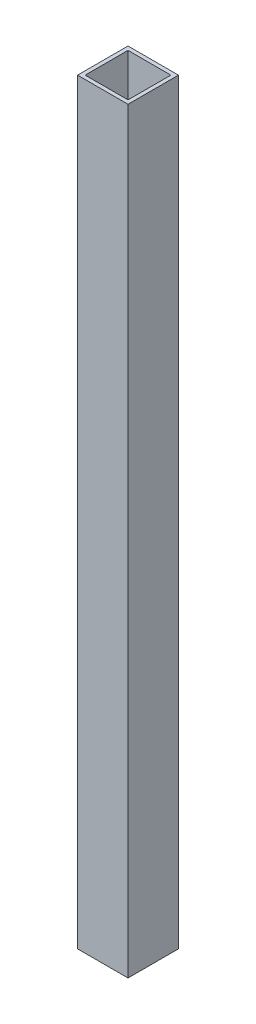
ISO-10303-21;
HEADER;
FILE_DESCRIPTION(('STEP AP214'),'2;1');
FILE_NAME('part.step','',(''),(''),'','','');
FILE_SCHEMA(('AUTOMOTIVE_DESIGN { 1 0 10303 214 1 1 1 1 }'));
ENDSEC;
DATA;
#1=APPLICATION_CONTEXT('core data for automotive mechanical design processes');
#2=APPLICATION_PROTOCOL_DEFINITION('international standard','automotive_design',2000,#1);
#3=PRODUCT_CONTEXT('',#1,'mechanical');
#4=PRODUCT('Part','Part','',(#3));
#5=PRODUCT_RELATED_PRODUCT_CATEGORY('part','',(#4));
#6=PRODUCT_DEFINITION_FORMATION('','',#4);
#7=PRODUCT_DEFINITION_CONTEXT('part definition',#1,'design');
#8=PRODUCT_DEFINITION('design','',#6,#7);
#9=PRODUCT_DEFINITION_SHAPE('','',#8);
#10=(LENGTH_UNIT() NAMED_UNIT(*) SI_UNIT(.MILLI.,.METRE.));
#11=(NAMED_UNIT(*) PLANE_ANGLE_UNIT() SI_UNIT($,.RADIAN.));
#12=(NAMED_UNIT(*) SI_UNIT($,.STERADIAN.) SOLID_ANGLE_UNIT());
#13=UNCERTAINTY_MEASURE_WITH_UNIT(LENGTH_MEASURE(1.E-05),#10,'distance_accuracy_value','');
#14=(GEOMETRIC_REPRESENTATION_CONTEXT(3) GLOBAL_UNCERTAINTY_ASSIGNED_CONTEXT((#13)) GLOBAL_UNIT_ASSIGNED_CONTEXT((#10,
#11,#12)) REPRESENTATION_CONTEXT('',''));
#15=CARTESIAN_POINT('',(0.,0.,0.));
#16=DIRECTION('',(0.,0.,1.));
#17=DIRECTION('',(1.,0.,0.));
#18=AXIS2_PLACEMENT_3D('',#15,#16,#17);
#19=CARTESIAN_POINT('',(0.,300.,0.));
#20=DIRECTION('',(0.,-1.,0.));
#21=DIRECTION('',(0.,0.,-1.));
#22=AXIS2_PLACEMENT_3D('',#19,#20,#21);
#23=PLANE('',#22);
#24=DIRECTION('',(0.,0.,-1.));
#25=VECTOR('',#24,1.);
#26=CARTESIAN_POINT('',(10.,300.,10.));
#27=LINE('',#26,#25);
#28=CARTESIAN_POINT('',(10.,300.,10.));
#29=VERTEX_POINT('',#28);
#30=CARTESIAN_POINT('',(10.,300.,-9.99999999999999));
#31=VERTEX_POINT('',#30);
#32=EDGE_CURVE('E155',#29,#31,#27,.T.);
#33=ORIENTED_EDGE('',*,*,#32,.T.);
#34=DIRECTION('',(-1.,0.,0.));
#35=VECTOR('',#34,1.);
#36=CARTESIAN_POINT('',(-9.99999999999996,300.,-9.99999999999999));
#37=LINE('',#36,#35);
#38=CARTESIAN_POINT('',(-9.99999999999996,300.,-9.99999999999999));
#39=VERTEX_POINT('',#38);
#40=EDGE_CURVE('E159',#31,#39,#37,.T.);
#41=ORIENTED_EDGE('',*,*,#40,.T.);
#42=DIRECTION('',(0.,0.,1.));
#43=VECTOR('',#42,1.);
#44=CARTESIAN_POINT('',(-9.99999999999996,300.,10.));
#45=LINE('',#44,#43);
#46=CARTESIAN_POINT('',(-9.99999999999996,300.,10.));
#47=VERTEX_POINT('',#46);
#48=EDGE_CURVE('E163',#39,#47,#45,.T.);
#49=ORIENTED_EDGE('',*,*,#48,.T.);
#50=DIRECTION('',(1.,0.,0.));
#51=VECTOR('',#50,1.);
#52=CARTESIAN_POINT('',(-9.99999999999996,300.,10.));
#53=LINE('',#52,#51);
#54=EDGE_CURVE('E166',#47,#29,#53,.T.);
#55=ORIENTED_EDGE('',*,*,#54,.T.);
#56=EDGE_LOOP('',(#33,#41,#49,#55));
#57=FACE_BOUND('',#56,.T.);
#58=DIRECTION('',(0.,0.,-1.));
#59=VECTOR('',#58,1.);
#60=CARTESIAN_POINT('',(8.5,300.,8.50000000000001));
#61=LINE('',#60,#59);
#62=CARTESIAN_POINT('',(8.5,300.,8.50000000000001));
#63=VERTEX_POINT('',#62);
#64=CARTESIAN_POINT('',(8.50000000000001,300.,-8.5));
#65=VERTEX_POINT('',#64);
#66=EDGE_CURVE('E107',#63,#65,#61,.T.);
#67=ORIENTED_EDGE('',*,*,#66,.F.);
#68=DIRECTION('',(1.,0.,0.));
#69=VECTOR('',#68,1.);
#70=CARTESIAN_POINT('',(-8.5,300.,8.50000000000001));
#71=LINE('',#70,#69);
#72=CARTESIAN_POINT('',(-8.5,300.,8.50000000000001));
#73=VERTEX_POINT('',#72);
#74=EDGE_CURVE('E133',#73,#63,#71,.T.);
#75=ORIENTED_EDGE('',*,*,#74,.F.);
#76=DIRECTION('',(0.,0.,1.));
#77=VECTOR('',#76,1.);
#78=CARTESIAN_POINT('',(-8.5,300.,8.50000000000001));
#79=LINE('',#78,#77);
#80=CARTESIAN_POINT('',(-8.49999999999999,300.,-8.5));
#81=VERTEX_POINT('',#80);
#82=EDGE_CURVE('E129',#81,#73,#79,.T.);
#83=ORIENTED_EDGE('',*,*,#82,.F.);
#84=DIRECTION('',(-1.,0.,0.));
#85=VECTOR('',#84,1.);
#86=CARTESIAN_POINT('',(-8.49999999999999,300.,-8.5));
#87=LINE('',#86,#85);
#88=EDGE_CURVE('E116',#65,#81,#87,.T.);
#89=ORIENTED_EDGE('',*,*,#88,.F.);
#90=EDGE_LOOP('',(#67,#75,#83,#89));
#91=FACE_BOUND('',#90,.T.);
#92=ADVANCED_FACE('F41',(#57,#91),#23,.F.);
#93=CARTESIAN_POINT('',(0.,0.,0.));
#94=DIRECTION('',(0.,-1.,0.));
#95=DIRECTION('',(0.,0.,-1.));
#96=AXIS2_PLACEMENT_3D('',#93,#94,#95);
#97=PLANE('',#96);
#98=DIRECTION('',(0.,0.,-1.));
#99=VECTOR('',#98,1.);
#100=CARTESIAN_POINT('',(10.,0.,10.));
#101=LINE('',#100,#99);
#102=CARTESIAN_POINT('',(10.,0.,10.));
#103=VERTEX_POINT('',#102);
#104=CARTESIAN_POINT('',(10.,0.,-9.99999999999999));
#105=VERTEX_POINT('',#104);
#106=EDGE_CURVE('E125',#103,#105,#101,.T.);
#107=ORIENTED_EDGE('',*,*,#106,.F.);
#108=DIRECTION('',(1.,0.,0.));
#109=VECTOR('',#108,1.);
#110=CARTESIAN_POINT('',(-9.99999999999996,0.,10.));
#111=LINE('',#110,#109);
#112=CARTESIAN_POINT('',(-9.99999999999996,0.,10.));
#113=VERTEX_POINT('',#112);
#114=EDGE_CURVE('E160',#113,#103,#111,.T.);
#115=ORIENTED_EDGE('',*,*,#114,.F.);
#116=DIRECTION('',(0.,0.,1.));
#117=VECTOR('',#116,1.);
#118=CARTESIAN_POINT('',(-9.99999999999996,0.,10.));
#119=LINE('',#118,#117);
#120=CARTESIAN_POINT('',(-9.99999999999996,0.,-9.99999999999999));
#121=VERTEX_POINT('',#120);
#122=EDGE_CURVE('E176',#121,#113,#119,.T.);
#123=ORIENTED_EDGE('',*,*,#122,.F.);
#124=DIRECTION('',(-1.,0.,0.));
#125=VECTOR('',#124,1.);
#126=CARTESIAN_POINT('',(-9.99999999999996,0.,-9.99999999999999));
#127=LINE('',#126,#125);
#128=EDGE_CURVE('E173',#105,#121,#127,.T.);
#129=ORIENTED_EDGE('',*,*,#128,.F.);
#130=EDGE_LOOP('',(#107,#115,#123,#129));
#131=FACE_BOUND('',#130,.T.);
#132=DIRECTION('',(1.,0.,0.));
#133=VECTOR('',#132,1.);
#134=CARTESIAN_POINT('',(-8.5,0.,8.50000000000001));
#135=LINE('',#134,#133);
#136=CARTESIAN_POINT('',(-8.5,0.,8.50000000000001));
#137=VERTEX_POINT('',#136);
#138=CARTESIAN_POINT('',(8.5,0.,8.50000000000001));
#139=VERTEX_POINT('',#138);
#140=EDGE_CURVE('E117',#137,#139,#135,.T.);
#141=ORIENTED_EDGE('',*,*,#140,.T.);
#142=DIRECTION('',(0.,0.,-1.));
#143=VECTOR('',#142,1.);
#144=CARTESIAN_POINT('',(8.5,0.,8.50000000000001));
#145=LINE('',#144,#143);
#146=CARTESIAN_POINT('',(8.50000000000001,0.,-8.5));
#147=VERTEX_POINT('',#146);
#148=EDGE_CURVE('E65',#139,#147,#145,.T.);
#149=ORIENTED_EDGE('',*,*,#148,.T.);
#150=DIRECTION('',(-1.,0.,0.));
#151=VECTOR('',#150,1.);
#152=CARTESIAN_POINT('',(-8.49999999999999,0.,-8.5));
#153=LINE('',#152,#151);
#154=CARTESIAN_POINT('',(-8.49999999999999,0.,-8.5));
#155=VERTEX_POINT('',#154);
#156=EDGE_CURVE('E123',#147,#155,#153,.T.);
#157=ORIENTED_EDGE('',*,*,#156,.T.);
#158=DIRECTION('',(0.,0.,1.));
#159=VECTOR('',#158,1.);
#160=CARTESIAN_POINT('',(-8.5,0.,8.50000000000001));
#161=LINE('',#160,#159);
#162=EDGE_CURVE('E142',#155,#137,#161,.T.);
#163=ORIENTED_EDGE('',*,*,#162,.T.);
#164=EDGE_LOOP('',(#141,#149,#157,#163));
#165=FACE_BOUND('',#164,.T.);
#166=ADVANCED_FACE('F199',(#131,#165),#97,.T.);
#167=CARTESIAN_POINT('',(10.,300.,10.));
#168=DIRECTION('',(-1.,0.,0.));
#169=DIRECTION('',(0.,0.,1.));
#170=AXIS2_PLACEMENT_3D('',#167,#168,#169);
#171=PLANE('',#170);
#172=ORIENTED_EDGE('',*,*,#106,.T.);
#173=DIRECTION('',(0.,-1.,0.));
#174=VECTOR('',#173,1.);
#175=CARTESIAN_POINT('',(10.,300.,-9.99999999999999));
#176=LINE('',#175,#174);
#177=EDGE_CURVE('E11',#31,#105,#176,.T.);
#178=ORIENTED_EDGE('',*,*,#177,.F.);
#179=ORIENTED_EDGE('',*,*,#32,.F.);
#180=DIRECTION('',(0.,-1.,0.));
#181=VECTOR('',#180,1.);
#182=CARTESIAN_POINT('',(10.,300.,10.));
#183=LINE('',#182,#181);
#184=EDGE_CURVE('E169',#29,#103,#183,.T.);
#185=ORIENTED_EDGE('',*,*,#184,.T.);
#186=EDGE_LOOP('',(#172,#178,#179,#185));
#187=FACE_BOUND('',#186,.T.);
#188=ADVANCED_FACE('F43',(#187),#171,.F.);
#189=CARTESIAN_POINT('',(-9.99999999999996,300.,-9.99999999999999));
#190=DIRECTION('',(0.,0.,1.));
#191=DIRECTION('',(1.,0.,0.));
#192=AXIS2_PLACEMENT_3D('',#189,#190,#191);
#193=PLANE('',#192);
#194=ORIENTED_EDGE('',*,*,#128,.T.);
#195=DIRECTION('',(0.,-1.,0.));
#196=VECTOR('',#195,1.);
#197=CARTESIAN_POINT('',(-9.99999999999996,300.,-9.99999999999999));
#198=LINE('',#197,#196);
#199=EDGE_CURVE('E50',#39,#121,#198,.T.);
#200=ORIENTED_EDGE('',*,*,#199,.F.);
#201=ORIENTED_EDGE('',*,*,#40,.F.);
#202=ORIENTED_EDGE('',*,*,#177,.T.);
#203=EDGE_LOOP('',(#194,#200,#201,#202));
#204=FACE_BOUND('',#203,.T.);
#205=ADVANCED_FACE('F209',(#204),#193,.F.);
#206=CARTESIAN_POINT('',(-9.99999999999996,300.,10.));
#207=DIRECTION('',(1.,0.,0.));
#208=DIRECTION('',(0.,0.,-1.));
#209=AXIS2_PLACEMENT_3D('',#206,#207,#208);
#210=PLANE('',#209);
#211=ORIENTED_EDGE('',*,*,#122,.T.);
#212=DIRECTION('',(0.,-1.,0.));
#213=VECTOR('',#212,1.);
#214=CARTESIAN_POINT('',(-9.99999999999996,300.,10.));
#215=LINE('',#214,#213);
#216=EDGE_CURVE('E184',#47,#113,#215,.T.);
#217=ORIENTED_EDGE('',*,*,#216,.F.);
#218=ORIENTED_EDGE('',*,*,#48,.F.);
#219=ORIENTED_EDGE('',*,*,#199,.T.);
#220=EDGE_LOOP('',(#211,#217,#218,#219));
#221=FACE_BOUND('',#220,.T.);
#222=ADVANCED_FACE('F193',(#221),#210,.F.);
#223=CARTESIAN_POINT('',(-9.99999999999996,300.,10.));
#224=DIRECTION('',(0.,0.,-1.));
#225=DIRECTION('',(-1.,0.,0.));
#226=AXIS2_PLACEMENT_3D('',#223,#224,#225);
#227=PLANE('',#226);
#228=ORIENTED_EDGE('',*,*,#114,.T.);
#229=ORIENTED_EDGE('',*,*,#184,.F.);
#230=ORIENTED_EDGE('',*,*,#54,.F.);
#231=ORIENTED_EDGE('',*,*,#216,.T.);
#232=EDGE_LOOP('',(#228,#229,#230,#231));
#233=FACE_BOUND('',#232,.T.);
#234=ADVANCED_FACE('F203',(#233),#227,.F.);
#235=CARTESIAN_POINT('',(8.5,300.,8.50000000000001));
#236=DIRECTION('',(-1.,0.,0.));
#237=DIRECTION('',(0.,0.,1.));
#238=AXIS2_PLACEMENT_3D('',#235,#236,#237);
#239=PLANE('',#238);
#240=ORIENTED_EDGE('',*,*,#148,.F.);
#241=DIRECTION('',(0.,-1.,0.));
#242=VECTOR('',#241,1.);
#243=CARTESIAN_POINT('',(8.5,300.,8.50000000000001));
#244=LINE('',#243,#242);
#245=EDGE_CURVE('E111',#63,#139,#244,.T.);
#246=ORIENTED_EDGE('',*,*,#245,.F.);
#247=ORIENTED_EDGE('',*,*,#66,.T.);
#248=DIRECTION('',(0.,-1.,0.));
#249=VECTOR('',#248,1.);
#250=CARTESIAN_POINT('',(8.50000000000001,300.,-8.5));
#251=LINE('',#250,#249);
#252=EDGE_CURVE('E110',#65,#147,#251,.T.);
#253=ORIENTED_EDGE('',*,*,#252,.T.);
#254=EDGE_LOOP('',(#240,#246,#247,#253));
#255=FACE_BOUND('',#254,.T.);
#256=ADVANCED_FACE('F109',(#255),#239,.T.);
#257=CARTESIAN_POINT('',(-8.49999999999999,300.,-8.5));
#258=DIRECTION('',(0.,0.,1.));
#259=DIRECTION('',(1.,0.,0.));
#260=AXIS2_PLACEMENT_3D('',#257,#258,#259);
#261=PLANE('',#260);
#262=ORIENTED_EDGE('',*,*,#156,.F.);
#263=ORIENTED_EDGE('',*,*,#252,.F.);
#264=ORIENTED_EDGE('',*,*,#88,.T.);
#265=DIRECTION('',(0.,-1.,0.));
#266=VECTOR('',#265,1.);
#267=CARTESIAN_POINT('',(-8.49999999999999,300.,-8.5));
#268=LINE('',#267,#266);
#269=EDGE_CURVE('E126',#81,#155,#268,.T.);
#270=ORIENTED_EDGE('',*,*,#269,.T.);
#271=EDGE_LOOP('',(#262,#263,#264,#270));
#272=FACE_BOUND('',#271,.T.);
#273=ADVANCED_FACE('F120',(#272),#261,.T.);
#274=CARTESIAN_POINT('',(-8.5,300.,8.50000000000001));
#275=DIRECTION('',(1.,0.,0.));
#276=DIRECTION('',(0.,0.,-1.));
#277=AXIS2_PLACEMENT_3D('',#274,#275,#276);
#278=PLANE('',#277);
#279=ORIENTED_EDGE('',*,*,#162,.F.);
#280=ORIENTED_EDGE('',*,*,#269,.F.);
#281=ORIENTED_EDGE('',*,*,#82,.T.);
#282=DIRECTION('',(0.,-1.,0.));
#283=VECTOR('',#282,1.);
#284=CARTESIAN_POINT('',(-8.5,300.,8.50000000000001));
#285=LINE('',#284,#283);
#286=EDGE_CURVE('E57',#73,#137,#285,.T.);
#287=ORIENTED_EDGE('',*,*,#286,.T.);
#288=EDGE_LOOP('',(#279,#280,#281,#287));
#289=FACE_BOUND('',#288,.T.);
#290=ADVANCED_FACE('F232',(#289),#278,.T.);
#291=CARTESIAN_POINT('',(-8.5,300.,8.50000000000001));
#292=DIRECTION('',(0.,0.,-1.));
#293=DIRECTION('',(-1.,0.,0.));
#294=AXIS2_PLACEMENT_3D('',#291,#292,#293);
#295=PLANE('',#294);
#296=ORIENTED_EDGE('',*,*,#140,.F.);
#297=ORIENTED_EDGE('',*,*,#286,.F.);
#298=ORIENTED_EDGE('',*,*,#74,.T.);
#299=ORIENTED_EDGE('',*,*,#245,.T.);
#300=EDGE_LOOP('',(#296,#297,#298,#299));
#301=FACE_BOUND('',#300,.T.);
#302=ADVANCED_FACE('F236',(#301),#295,.T.);
#303=CLOSED_SHELL('',(#92,#166,#188,#205,#222,#234,#256,#273,#290,#302));
#304=MANIFOLD_SOLID_BREP('B2',#303);
#305=ADVANCED_BREP_SHAPE_REPRESENTATION('',(#18,#304),#14);
#306=SHAPE_DEFINITION_REPRESENTATION(#9,#305);
ENDSEC;
END-ISO-10303-21;
